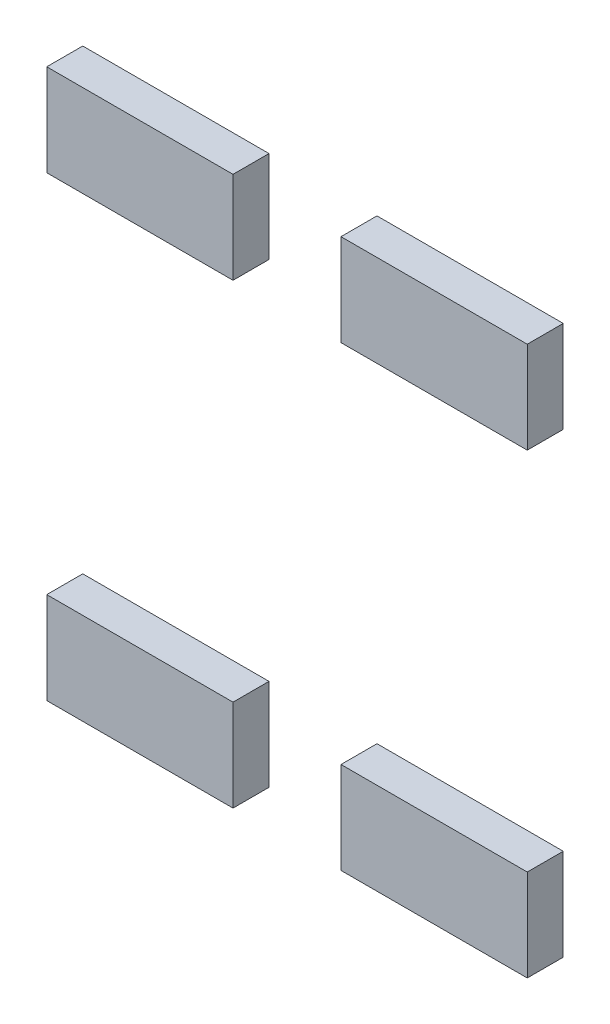
ISO-10303-21;
HEADER;
FILE_DESCRIPTION(('STEP AP214'),'2;1');
FILE_NAME('part.step','',(''),(''),'','','');
FILE_SCHEMA(('AUTOMOTIVE_DESIGN { 1 0 10303 214 1 1 1 1 }'));
ENDSEC;
DATA;
#1=APPLICATION_CONTEXT('core data for automotive mechanical design processes');
#2=APPLICATION_PROTOCOL_DEFINITION('international standard','automotive_design',2000,#1);
#3=PRODUCT_CONTEXT('',#1,'mechanical');
#4=PRODUCT('Part','Part','',(#3));
#5=PRODUCT_RELATED_PRODUCT_CATEGORY('part','',(#4));
#6=PRODUCT_DEFINITION_FORMATION('','',#4);
#7=PRODUCT_DEFINITION_CONTEXT('part definition',#1,'design');
#8=PRODUCT_DEFINITION('design','',#6,#7);
#9=PRODUCT_DEFINITION_SHAPE('','',#8);
#10=(LENGTH_UNIT() NAMED_UNIT(*) SI_UNIT(.MILLI.,.METRE.));
#11=(NAMED_UNIT(*) PLANE_ANGLE_UNIT() SI_UNIT($,.RADIAN.));
#12=(NAMED_UNIT(*) SI_UNIT($,.STERADIAN.) SOLID_ANGLE_UNIT());
#13=UNCERTAINTY_MEASURE_WITH_UNIT(LENGTH_MEASURE(1.E-05),#10,'distance_accuracy_value','');
#14=(GEOMETRIC_REPRESENTATION_CONTEXT(3) GLOBAL_UNCERTAINTY_ASSIGNED_CONTEXT((#13)) GLOBAL_UNIT_ASSIGNED_CONTEXT((#10,
#11,#12)) REPRESENTATION_CONTEXT('',''));
#15=CARTESIAN_POINT('',(0.,0.,0.));
#16=DIRECTION('',(0.,0.,1.));
#17=DIRECTION('',(1.,0.,0.));
#18=AXIS2_PLACEMENT_3D('',#15,#16,#17);
#19=CARTESIAN_POINT('',(55.000001221491,70.3750006,0.));
#20=DIRECTION('',(0.,0.,-1.));
#21=DIRECTION('',(-1.,0.,0.));
#22=AXIS2_PLACEMENT_3D('',#19,#20,#21);
#23=PLANE('',#22);
#24=DIRECTION('',(1.19248806385E-08,-1.,0.));
#25=VECTOR('',#24,1.);
#26=CARTESIAN_POINT('',(54.700001193985,72.681561596423,0.));
#27=LINE('',#26,#25);
#28=CARTESIAN_POINT('',(54.7000012018149,72.0250005902513,0.));
#29=VERTEX_POINT('',#28);
#30=CARTESIAN_POINT('',(54.7000012063758,71.515000596423,0.));
#31=VERTEX_POINT('',#30);
#32=EDGE_CURVE('P0_E20',#29,#31,#27,.T.);
#33=ORIENTED_EDGE('',*,*,#32,.T.);
#34=DIRECTION('',(1.,1.19248806385E-08,0.));
#35=VECTOR('',#34,1.);
#36=CARTESIAN_POINT('',(58.665001207896,71.515000643705,0.));
#37=LINE('',#36,#35);
#38=CARTESIAN_POINT('',(53.6650012078963,71.5150005871659,0.));
#39=VERTEX_POINT('',#38);
#40=EDGE_CURVE('P0_E81',#39,#31,#37,.T.);
#41=ORIENTED_EDGE('',*,*,#40,.F.);
#42=DIRECTION('',(1.19248806385E-08,-1.,0.));
#43=VECTOR('',#42,1.);
#44=CARTESIAN_POINT('',(53.665001241167,68.72500058408,0.));
#45=LINE('',#44,#43);
#46=CARTESIAN_POINT('',(53.6650012048555,72.02500058408,0.));
#47=VERTEX_POINT('',#46);
#48=EDGE_CURVE('P0_E55',#47,#39,#45,.T.);
#49=ORIENTED_EDGE('',*,*,#48,.F.);
#50=DIRECTION('',(-1.,-1.19248806385E-08,0.));
#51=VECTOR('',#50,1.);
#52=CARTESIAN_POINT('',(53.665001201815,72.02500058408,0.));
#53=LINE('',#52,#51);
#54=EDGE_CURVE('P0_E57',#29,#47,#53,.T.);
#55=ORIENTED_EDGE('',*,*,#54,.F.);
#56=EDGE_LOOP('',(#33,#41,#49,#55));
#57=FACE_BOUND('',#56,.T.);
#58=ADVANCED_FACE('P0_F17',(#57),#23,.T.);
#59=CARTESIAN_POINT('',(54.700001193985,72.681561596423,5.));
#60=DIRECTION('',(-1.,-1.19248806385E-08,0.));
#61=DIRECTION('',(1.19248806385E-08,-1.,0.));
#62=AXIS2_PLACEMENT_3D('',#59,#60,#61);
#63=PLANE('',#62);
#64=DIRECTION('',(0.,1.,0.));
#65=VECTOR('',#64,1.);
#66=CARTESIAN_POINT('',(54.700001207896,68.468354556295,0.199999999999999));
#67=LINE('',#66,#65);
#68=CARTESIAN_POINT('',(54.7000012078961,71.5150005933372,0.199999999999999));
#69=VERTEX_POINT('',#68);
#70=CARTESIAN_POINT('',(54.700001203335,72.0250005964228,0.199999999999998));
#71=VERTEX_POINT('',#70);
#72=EDGE_CURVE('P0_E83',#69,#71,#67,.T.);
#73=ORIENTED_EDGE('',*,*,#72,.F.);
#74=DIRECTION('',(0.,0.,1.));
#75=VECTOR('',#74,1.);
#76=CARTESIAN_POINT('',(54.700001207896,71.5150005964229,2.57));
#77=LINE('',#76,#75);
#78=EDGE_CURVE('P0_E68',#31,#69,#77,.T.);
#79=ORIENTED_EDGE('',*,*,#78,.F.);
#80=ORIENTED_EDGE('',*,*,#32,.F.);
#81=DIRECTION('',(0.,0.,1.));
#82=VECTOR('',#81,1.);
#83=CARTESIAN_POINT('',(54.700001201815,72.0250005964223,0.));
#84=LINE('',#83,#82);
#85=EDGE_CURVE('P0_E63',#71,#29,#84,.F.);
#86=ORIENTED_EDGE('',*,*,#85,.F.);
#87=EDGE_LOOP('',(#73,#79,#80,#86));
#88=FACE_BOUND('',#87,.T.);
#89=ADVANCED_FACE('P0_F65',(#88),#63,.F.);
#90=CARTESIAN_POINT('',(53.665001201815,72.02500058408,0.));
#91=DIRECTION('',(-1.19248806385E-08,1.,0.));
#92=DIRECTION('',(-1.,-1.19248806385E-08,0.));
#93=AXIS2_PLACEMENT_3D('',#90,#91,#92);
#94=PLANE('',#93);
#95=DIRECTION('',(1.,0.,0.));
#96=VECTOR('',#95,1.);
#97=CARTESIAN_POINT('',(51.335001244227,72.025000596423,0.2));
#98=LINE('',#97,#96);
#99=CARTESIAN_POINT('',(53.665001201815,72.0250005871658,0.2));
#100=VERTEX_POINT('',#99);
#101=EDGE_CURVE('P0_E72',#71,#100,#98,.F.);
#102=ORIENTED_EDGE('',*,*,#101,.F.);
#103=ORIENTED_EDGE('',*,*,#85,.T.);
#104=ORIENTED_EDGE('',*,*,#54,.T.);
#105=DIRECTION('',(0.,0.,1.));
#106=VECTOR('',#105,1.);
#107=CARTESIAN_POINT('',(53.6650012018149,72.02500058408,0.));
#108=LINE('',#107,#106);
#109=EDGE_CURVE('P0_E75',#100,#47,#108,.F.);
#110=ORIENTED_EDGE('',*,*,#109,.F.);
#111=EDGE_LOOP('',(#102,#103,#104,#110));
#112=FACE_BOUND('',#111,.T.);
#113=ADVANCED_FACE('P0_F70',(#112),#94,.T.);
#114=CARTESIAN_POINT('',(53.665001241167,68.72500058408,0.));
#115=DIRECTION('',(-1.,-1.19248806385E-08,0.));
#116=DIRECTION('',(1.19248806385E-08,-1.,0.));
#117=AXIS2_PLACEMENT_3D('',#114,#115,#116);
#118=PLANE('',#117);
#119=DIRECTION('',(0.,1.,0.));
#120=VECTOR('',#119,1.);
#121=CARTESIAN_POINT('',(53.665001201815,68.468354556295,0.199999999999999));
#122=LINE('',#121,#120);
#123=CARTESIAN_POINT('',(53.665001206376,71.5150005840802,0.2));
#124=VERTEX_POINT('',#123);
#125=EDGE_CURVE('P0_E26',#100,#124,#122,.F.);
#126=ORIENTED_EDGE('',*,*,#125,.F.);
#127=ORIENTED_EDGE('',*,*,#109,.T.);
#128=ORIENTED_EDGE('',*,*,#48,.T.);
#129=DIRECTION('',(0.,0.,1.));
#130=VECTOR('',#129,1.);
#131=CARTESIAN_POINT('',(53.665001207896,71.5150005840806,2.57));
#132=LINE('',#131,#130);
#133=EDGE_CURVE('P0_E35',#124,#39,#132,.F.);
#134=ORIENTED_EDGE('',*,*,#133,.F.);
#135=EDGE_LOOP('',(#126,#127,#128,#134));
#136=FACE_BOUND('',#135,.T.);
#137=ADVANCED_FACE('P0_F89',(#136),#118,.T.);
#138=CARTESIAN_POINT('',(58.665001207896,71.515000643705,2.57));
#139=DIRECTION('',(1.19248806385E-08,-1.,0.));
#140=DIRECTION('',(1.,1.19248806385E-08,0.));
#141=AXIS2_PLACEMENT_3D('',#138,#139,#140);
#142=PLANE('',#141);
#143=ORIENTED_EDGE('',*,*,#133,.T.);
#144=ORIENTED_EDGE('',*,*,#40,.T.);
#145=ORIENTED_EDGE('',*,*,#78,.T.);
#146=DIRECTION('',(1.,0.,0.));
#147=VECTOR('',#146,1.);
#148=CARTESIAN_POINT('',(51.335001244227,71.51500058408,0.2));
#149=LINE('',#148,#147);
#150=EDGE_CURVE('P0_E11',#124,#69,#149,.T.);
#151=ORIENTED_EDGE('',*,*,#150,.F.);
#152=EDGE_LOOP('',(#143,#144,#145,#151));
#153=FACE_BOUND('',#152,.T.);
#154=ADVANCED_FACE('P0_F91',(#153),#142,.T.);
#155=CARTESIAN_POINT('',(51.335001244227,68.468354556295,0.2));
#156=DIRECTION('',(0.,0.,1.));
#157=DIRECTION('',(1.,0.,0.));
#158=AXIS2_PLACEMENT_3D('',#155,#156,#157);
#159=PLANE('',#158);
#160=ORIENTED_EDGE('',*,*,#125,.T.);
#161=ORIENTED_EDGE('',*,*,#150,.T.);
#162=ORIENTED_EDGE('',*,*,#72,.T.);
#163=ORIENTED_EDGE('',*,*,#101,.T.);
#164=EDGE_LOOP('',(#160,#161,#162,#163));
#165=FACE_BOUND('',#164,.T.);
#166=ADVANCED_FACE('P0_F88',(#165),#159,.T.);
#167=CLOSED_SHELL('',(#58,#89,#113,#137,#154,#166));
#168=MANIFOLD_SOLID_BREP('P0_B1',#167);
#169=CARTESIAN_POINT('',(55.000001218509,70.6250006,0.));
#170=DIRECTION('',(0.,0.,-1.));
#171=DIRECTION('',(-1.,0.,0.));
#172=AXIS2_PLACEMENT_3D('',#169,#170,#171);
#173=PLANE('',#172);
#174=DIRECTION('',(1.,1.19248806385E-08,0.));
#175=VECTOR('',#174,1.);
#176=CARTESIAN_POINT('',(56.335001238185,68.97500061592,0.));
#177=LINE('',#176,#175);
#178=CARTESIAN_POINT('',(55.300001238185,68.9750006097487,0.));
#179=VERTEX_POINT('',#178);
#180=CARTESIAN_POINT('',(56.3350012351445,68.97500061592,0.));
#181=VERTEX_POINT('',#180);
#182=EDGE_CURVE('P1_E79',#179,#181,#177,.T.);
#183=ORIENTED_EDGE('',*,*,#182,.F.);
#184=DIRECTION('',(-1.19248806385E-08,1.,0.));
#185=VECTOR('',#184,1.);
#186=CARTESIAN_POINT('',(55.300001245817,68.335000603577,0.));
#187=LINE('',#186,#185);
#188=CARTESIAN_POINT('',(55.3000012351444,69.4850006035772,0.));
#189=VERTEX_POINT('',#188);
#190=EDGE_CURVE('P1_E55',#179,#189,#187,.T.);
#191=ORIENTED_EDGE('',*,*,#190,.T.);
#192=DIRECTION('',(1.,1.19248806385E-08,0.));
#193=VECTOR('',#192,1.);
#194=CARTESIAN_POINT('',(58.665001232104,69.485000643705,0.));
#195=LINE('',#194,#193);
#196=CARTESIAN_POINT('',(56.3350012321037,69.4850006128343,0.));
#197=VERTEX_POINT('',#196);
#198=EDGE_CURVE('P1_E67',#189,#197,#195,.T.);
#199=ORIENTED_EDGE('',*,*,#198,.T.);
#200=DIRECTION('',(-1.19248806385E-08,1.,0.));
#201=VECTOR('',#200,1.);
#202=CARTESIAN_POINT('',(56.335001198833,72.27500061592,0.));
#203=LINE('',#202,#201);
#204=EDGE_CURVE('P1_E20',#181,#197,#203,.T.);
#205=ORIENTED_EDGE('',*,*,#204,.F.);
#206=EDGE_LOOP('',(#183,#191,#199,#205));
#207=FACE_BOUND('',#206,.T.);
#208=ADVANCED_FACE('P1_F17',(#207),#173,.T.);
#209=CARTESIAN_POINT('',(56.335001198833,72.27500061592,0.));
#210=DIRECTION('',(1.,1.19248806385E-08,0.));
#211=DIRECTION('',(-1.19248806385E-08,1.,0.));
#212=AXIS2_PLACEMENT_3D('',#209,#210,#211);
#213=PLANE('',#212);
#214=DIRECTION('',(0.,1.,0.));
#215=VECTOR('',#214,1.);
#216=CARTESIAN_POINT('',(56.335001238185,68.718354556295,0.199999999999999));
#217=LINE('',#216,#215);
#218=CARTESIAN_POINT('',(56.3350012381851,68.9750006128342,0.2));
#219=VERTEX_POINT('',#218);
#220=CARTESIAN_POINT('',(56.335001233624,69.48500061592,0.2));
#221=VERTEX_POINT('',#220);
#222=EDGE_CURVE('P1_E83',#219,#221,#217,.T.);
#223=ORIENTED_EDGE('',*,*,#222,.F.);
#224=DIRECTION('',(0.,0.,1.));
#225=VECTOR('',#224,1.);
#226=CARTESIAN_POINT('',(56.335001238185,68.97500061592,0.));
#227=LINE('',#226,#225);
#228=EDGE_CURVE('P1_E65',#181,#219,#227,.T.);
#229=ORIENTED_EDGE('',*,*,#228,.F.);
#230=ORIENTED_EDGE('',*,*,#204,.T.);
#231=DIRECTION('',(0.,0.,1.));
#232=VECTOR('',#231,1.);
#233=CARTESIAN_POINT('',(56.335001232104,69.48500061592,2.57));
#234=LINE('',#233,#232);
#235=EDGE_CURVE('P1_E62',#197,#221,#234,.T.);
#236=ORIENTED_EDGE('',*,*,#235,.T.);
#237=EDGE_LOOP('',(#223,#229,#230,#236));
#238=FACE_BOUND('',#237,.T.);
#239=ADVANCED_FACE('P1_F60',(#238),#213,.T.);
#240=CARTESIAN_POINT('',(58.665001232104,69.485000643705,2.57));
#241=DIRECTION('',(1.19248806385E-08,-1.,0.));
#242=DIRECTION('',(1.,1.19248806385E-08,0.));
#243=AXIS2_PLACEMENT_3D('',#240,#241,#242);
#244=PLANE('',#243);
#245=DIRECTION('',(0.,0.,1.));
#246=VECTOR('',#245,1.);
#247=CARTESIAN_POINT('',(55.3000012321034,69.485000603577,5.));
#248=LINE('',#247,#246);
#249=CARTESIAN_POINT('',(55.3000012321039,69.4850006066631,0.199999999999999));
#250=VERTEX_POINT('',#249);
#251=EDGE_CURVE('P1_E77',#189,#250,#248,.T.);
#252=ORIENTED_EDGE('',*,*,#251,.T.);
#253=DIRECTION('',(1.,0.,0.));
#254=VECTOR('',#253,1.);
#255=CARTESIAN_POINT('',(51.335001241246,69.48500061592,0.2));
#256=LINE('',#255,#254);
#257=EDGE_CURVE('P1_E73',#221,#250,#256,.F.);
#258=ORIENTED_EDGE('',*,*,#257,.F.);
#259=ORIENTED_EDGE('',*,*,#235,.F.);
#260=ORIENTED_EDGE('',*,*,#198,.F.);
#261=EDGE_LOOP('',(#252,#258,#259,#260));
#262=FACE_BOUND('',#261,.T.);
#263=ADVANCED_FACE('P1_F71',(#262),#244,.F.);
#264=CARTESIAN_POINT('',(55.300001245817,68.335000603577,5.));
#265=DIRECTION('',(1.,1.19248806385E-08,0.));
#266=DIRECTION('',(-1.19248806385E-08,1.,0.));
#267=AXIS2_PLACEMENT_3D('',#264,#265,#266);
#268=PLANE('',#267);
#269=DIRECTION('',(0.,1.,0.));
#270=VECTOR('',#269,1.);
#271=CARTESIAN_POINT('',(55.300001232104,68.718354556295,0.199999999999999));
#272=LINE('',#271,#270);
#273=CARTESIAN_POINT('',(55.3000012366648,68.9750006035772,0.199999999999998));
#274=VERTEX_POINT('',#273);
#275=EDGE_CURVE('P1_E26',#250,#274,#272,.F.);
#276=ORIENTED_EDGE('',*,*,#275,.F.);
#277=ORIENTED_EDGE('',*,*,#251,.F.);
#278=ORIENTED_EDGE('',*,*,#190,.F.);
#279=DIRECTION('',(0.,0.,1.));
#280=VECTOR('',#279,1.);
#281=CARTESIAN_POINT('',(55.300001238185,68.9750006035777,0.));
#282=LINE('',#281,#280);
#283=EDGE_CURVE('P1_E35',#274,#179,#282,.F.);
#284=ORIENTED_EDGE('',*,*,#283,.F.);
#285=EDGE_LOOP('',(#276,#277,#278,#284));
#286=FACE_BOUND('',#285,.T.);
#287=ADVANCED_FACE('P1_F89',(#286),#268,.F.);
#288=CARTESIAN_POINT('',(56.335001238185,68.97500061592,0.));
#289=DIRECTION('',(1.19248806385E-08,-1.,0.));
#290=DIRECTION('',(1.,1.19248806385E-08,0.));
#291=AXIS2_PLACEMENT_3D('',#288,#289,#290);
#292=PLANE('',#291);
#293=DIRECTION('',(1.,0.,0.));
#294=VECTOR('',#293,1.);
#295=CARTESIAN_POINT('',(51.335001241246,68.975000603577,0.2));
#296=LINE('',#295,#294);
#297=EDGE_CURVE('P1_E11',#274,#219,#296,.T.);
#298=ORIENTED_EDGE('',*,*,#297,.F.);
#299=ORIENTED_EDGE('',*,*,#283,.T.);
#300=ORIENTED_EDGE('',*,*,#182,.T.);
#301=ORIENTED_EDGE('',*,*,#228,.T.);
#302=EDGE_LOOP('',(#298,#299,#300,#301));
#303=FACE_BOUND('',#302,.T.);
#304=ADVANCED_FACE('P1_F91',(#303),#292,.T.);
#305=CARTESIAN_POINT('',(51.335001241246,68.718354556295,0.2));
#306=DIRECTION('',(0.,0.,1.));
#307=DIRECTION('',(1.,0.,0.));
#308=AXIS2_PLACEMENT_3D('',#305,#306,#307);
#309=PLANE('',#308);
#310=ORIENTED_EDGE('',*,*,#275,.T.);
#311=ORIENTED_EDGE('',*,*,#297,.T.);
#312=ORIENTED_EDGE('',*,*,#222,.T.);
#313=ORIENTED_EDGE('',*,*,#257,.T.);
#314=EDGE_LOOP('',(#310,#311,#312,#313));
#315=FACE_BOUND('',#314,.T.);
#316=ADVANCED_FACE('P1_F88',(#315),#309,.T.);
#317=CLOSED_SHELL('',(#208,#239,#263,#287,#304,#316));
#318=MANIFOLD_SOLID_BREP('P1_B1',#317);
#319=CARTESIAN_POINT('',(55.000001221491,70.3750006,0.));
#320=DIRECTION('',(0.,0.,-1.));
#321=DIRECTION('',(-1.,0.,0.));
#322=AXIS2_PLACEMENT_3D('',#319,#320,#321);
#323=PLANE('',#322);
#324=DIRECTION('',(-1.19248806385E-08,1.,0.));
#325=VECTOR('',#324,1.);
#326=CARTESIAN_POINT('',(56.335001201815,72.02500061592,0.));
#327=LINE('',#326,#325);
#328=CARTESIAN_POINT('',(56.3350012063761,71.51500061592,0.));
#329=VERTEX_POINT('',#328);
#330=CARTESIAN_POINT('',(56.335001201815,72.0250006097484,0.));
#331=VERTEX_POINT('',#330);
#332=EDGE_CURVE('P2_E20',#329,#331,#327,.T.);
#333=ORIENTED_EDGE('',*,*,#332,.F.);
#334=DIRECTION('',(1.,1.19248806385E-08,0.));
#335=VECTOR('',#334,1.);
#336=CARTESIAN_POINT('',(58.665001207896,71.515000643705,0.));
#337=LINE('',#336,#335);
#338=CARTESIAN_POINT('',(55.3000012078963,71.5150006066629,0.));
#339=VERTEX_POINT('',#338);
#340=EDGE_CURVE('P2_E81',#339,#329,#337,.T.);
#341=ORIENTED_EDGE('',*,*,#340,.F.);
#342=DIRECTION('',(-1.19248806385E-08,1.,0.));
#343=VECTOR('',#342,1.);
#344=CARTESIAN_POINT('',(55.300001248799,68.085000603577,0.));
#345=LINE('',#344,#343);
#346=CARTESIAN_POINT('',(55.3000012048555,72.0250006035771,0.));
#347=VERTEX_POINT('',#346);
#348=EDGE_CURVE('P2_E55',#339,#347,#345,.T.);
#349=ORIENTED_EDGE('',*,*,#348,.T.);
#350=DIRECTION('',(-1.,-1.19248806385E-08,0.));
#351=VECTOR('',#350,1.);
#352=CARTESIAN_POINT('',(53.665001201815,72.02500058408,0.));
#353=LINE('',#352,#351);
#354=EDGE_CURVE('P2_E57',#331,#347,#353,.T.);
#355=ORIENTED_EDGE('',*,*,#354,.F.);
#356=EDGE_LOOP('',(#333,#341,#349,#355));
#357=FACE_BOUND('',#356,.T.);
#358=ADVANCED_FACE('P2_F17',(#357),#323,.T.);
#359=CARTESIAN_POINT('',(56.335001201815,72.02500061592,0.));
#360=DIRECTION('',(1.,1.19248806385E-08,0.));
#361=DIRECTION('',(-1.19248806385E-08,1.,0.));
#362=AXIS2_PLACEMENT_3D('',#359,#360,#361);
#363=PLANE('',#362);
#364=DIRECTION('',(0.,1.,0.));
#365=VECTOR('',#364,1.);
#366=CARTESIAN_POINT('',(56.335001207896,68.468354556295,0.199999999999999));
#367=LINE('',#366,#365);
#368=CARTESIAN_POINT('',(56.3350012078963,71.5150006128343,0.2));
#369=VERTEX_POINT('',#368);
#370=CARTESIAN_POINT('',(56.3350012033352,72.0250006159199,0.2));
#371=VERTEX_POINT('',#370);
#372=EDGE_CURVE('P2_E83',#369,#371,#367,.T.);
#373=ORIENTED_EDGE('',*,*,#372,.F.);
#374=DIRECTION('',(0.,0.,1.));
#375=VECTOR('',#374,1.);
#376=CARTESIAN_POINT('',(56.335001207896,71.51500061592,2.57));
#377=LINE('',#376,#375);
#378=EDGE_CURVE('P2_E68',#329,#369,#377,.T.);
#379=ORIENTED_EDGE('',*,*,#378,.F.);
#380=ORIENTED_EDGE('',*,*,#332,.T.);
#381=DIRECTION('',(0.,0.,1.));
#382=VECTOR('',#381,1.);
#383=CARTESIAN_POINT('',(56.335001201815,72.0250006159195,0.));
#384=LINE('',#383,#382);
#385=EDGE_CURVE('P2_E63',#371,#331,#384,.F.);
#386=ORIENTED_EDGE('',*,*,#385,.F.);
#387=EDGE_LOOP('',(#373,#379,#380,#386));
#388=FACE_BOUND('',#387,.T.);
#389=ADVANCED_FACE('P2_F65',(#388),#363,.T.);
#390=CARTESIAN_POINT('',(53.665001201815,72.02500058408,0.));
#391=DIRECTION('',(-1.19248806385E-08,1.,0.));
#392=DIRECTION('',(-1.,-1.19248806385E-08,0.));
#393=AXIS2_PLACEMENT_3D('',#390,#391,#392);
#394=PLANE('',#393);
#395=DIRECTION('',(1.,0.,0.));
#396=VECTOR('',#395,1.);
#397=CARTESIAN_POINT('',(51.335001244227,72.02500061592,0.2));
#398=LINE('',#397,#396);
#399=CARTESIAN_POINT('',(55.300001201815,72.0250006066629,0.2));
#400=VERTEX_POINT('',#399);
#401=EDGE_CURVE('P2_E72',#371,#400,#398,.F.);
#402=ORIENTED_EDGE('',*,*,#401,.F.);
#403=ORIENTED_EDGE('',*,*,#385,.T.);
#404=ORIENTED_EDGE('',*,*,#354,.T.);
#405=DIRECTION('',(0.,0.,1.));
#406=VECTOR('',#405,1.);
#407=CARTESIAN_POINT('',(55.300001201815,72.025000603577,5.));
#408=LINE('',#407,#406);
#409=EDGE_CURVE('P2_E75',#347,#400,#408,.T.);
#410=ORIENTED_EDGE('',*,*,#409,.T.);
#411=EDGE_LOOP('',(#402,#403,#404,#410));
#412=FACE_BOUND('',#411,.T.);
#413=ADVANCED_FACE('P2_F70',(#412),#394,.T.);
#414=CARTESIAN_POINT('',(55.300001248799,68.085000603577,5.));
#415=DIRECTION('',(1.,1.19248806385E-08,0.));
#416=DIRECTION('',(-1.19248806385E-08,1.,0.));
#417=AXIS2_PLACEMENT_3D('',#414,#415,#416);
#418=PLANE('',#417);
#419=DIRECTION('',(0.,1.,0.));
#420=VECTOR('',#419,1.);
#421=CARTESIAN_POINT('',(55.300001201815,68.468354556295,0.199999999999999));
#422=LINE('',#421,#420);
#423=CARTESIAN_POINT('',(55.3000012063761,71.5150006035772,0.199999999999998));
#424=VERTEX_POINT('',#423);
#425=EDGE_CURVE('P2_E26',#400,#424,#422,.F.);
#426=ORIENTED_EDGE('',*,*,#425,.F.);
#427=ORIENTED_EDGE('',*,*,#409,.F.);
#428=ORIENTED_EDGE('',*,*,#348,.F.);
#429=DIRECTION('',(0.,0.,1.));
#430=VECTOR('',#429,1.);
#431=CARTESIAN_POINT('',(55.300001207896,71.5150006035778,2.57));
#432=LINE('',#431,#430);
#433=EDGE_CURVE('P2_E35',#424,#339,#432,.F.);
#434=ORIENTED_EDGE('',*,*,#433,.F.);
#435=EDGE_LOOP('',(#426,#427,#428,#434));
#436=FACE_BOUND('',#435,.T.);
#437=ADVANCED_FACE('P2_F89',(#436),#418,.F.);
#438=CARTESIAN_POINT('',(58.665001207896,71.515000643705,2.57));
#439=DIRECTION('',(1.19248806385E-08,-1.,0.));
#440=DIRECTION('',(1.,1.19248806385E-08,0.));
#441=AXIS2_PLACEMENT_3D('',#438,#439,#440);
#442=PLANE('',#441);
#443=ORIENTED_EDGE('',*,*,#433,.T.);
#444=ORIENTED_EDGE('',*,*,#340,.T.);
#445=ORIENTED_EDGE('',*,*,#378,.T.);
#446=DIRECTION('',(1.,0.,0.));
#447=VECTOR('',#446,1.);
#448=CARTESIAN_POINT('',(51.335001244227,71.515000603577,0.2));
#449=LINE('',#448,#447);
#450=EDGE_CURVE('P2_E11',#424,#369,#449,.T.);
#451=ORIENTED_EDGE('',*,*,#450,.F.);
#452=EDGE_LOOP('',(#443,#444,#445,#451));
#453=FACE_BOUND('',#452,.T.);
#454=ADVANCED_FACE('P2_F91',(#453),#442,.T.);
#455=CARTESIAN_POINT('',(51.335001244227,68.468354556295,0.2));
#456=DIRECTION('',(0.,0.,1.));
#457=DIRECTION('',(1.,0.,0.));
#458=AXIS2_PLACEMENT_3D('',#455,#456,#457);
#459=PLANE('',#458);
#460=ORIENTED_EDGE('',*,*,#425,.T.);
#461=ORIENTED_EDGE('',*,*,#450,.T.);
#462=ORIENTED_EDGE('',*,*,#372,.T.);
#463=ORIENTED_EDGE('',*,*,#401,.T.);
#464=EDGE_LOOP('',(#460,#461,#462,#463));
#465=FACE_BOUND('',#464,.T.);
#466=ADVANCED_FACE('P2_F88',(#465),#459,.T.);
#467=CLOSED_SHELL('',(#358,#389,#413,#437,#454,#466));
#468=MANIFOLD_SOLID_BREP('P2_B1',#467);
#469=CARTESIAN_POINT('',(55.000001218509,70.6250006,0.));
#470=DIRECTION('',(0.,0.,-1.));
#471=DIRECTION('',(-1.,0.,0.));
#472=AXIS2_PLACEMENT_3D('',#469,#470,#471);
#473=PLANE('',#472);
#474=DIRECTION('',(1.,1.19248806385E-08,0.));
#475=VECTOR('',#474,1.);
#476=CARTESIAN_POINT('',(56.335001238185,68.97500061592,0.));
#477=LINE('',#476,#475);
#478=CARTESIAN_POINT('',(53.665001238185,68.9750005902516,0.));
#479=VERTEX_POINT('',#478);
#480=CARTESIAN_POINT('',(54.7000012351446,68.9750005964229,0.));
#481=VERTEX_POINT('',#480);
#482=EDGE_CURVE('P3_E79',#479,#481,#477,.T.);
#483=ORIENTED_EDGE('',*,*,#482,.F.);
#484=DIRECTION('',(1.19248806385E-08,-1.,0.));
#485=VECTOR('',#484,1.);
#486=CARTESIAN_POINT('',(53.665001238185,68.97500058408,0.));
#487=LINE('',#486,#485);
#488=CARTESIAN_POINT('',(53.6650012351443,69.4850005840802,0.));
#489=VERTEX_POINT('',#488);
#490=EDGE_CURVE('P3_E55',#489,#479,#487,.T.);
#491=ORIENTED_EDGE('',*,*,#490,.F.);
#492=DIRECTION('',(1.,1.19248806385E-08,0.));
#493=VECTOR('',#492,1.);
#494=CARTESIAN_POINT('',(58.665001232104,69.485000643705,0.));
#495=LINE('',#494,#493);
#496=CARTESIAN_POINT('',(54.7000012321039,69.4850005933372,0.));
#497=VERTEX_POINT('',#496);
#498=EDGE_CURVE('P3_E67',#489,#497,#495,.T.);
#499=ORIENTED_EDGE('',*,*,#498,.T.);
#500=DIRECTION('',(1.19248806385E-08,-1.,0.));
#501=VECTOR('',#500,1.);
#502=CARTESIAN_POINT('',(54.700001191004,72.931561596423,0.));
#503=LINE('',#502,#501);
#504=EDGE_CURVE('P3_E20',#497,#481,#503,.T.);
#505=ORIENTED_EDGE('',*,*,#504,.T.);
#506=EDGE_LOOP('',(#483,#491,#499,#505));
#507=FACE_BOUND('',#506,.T.);
#508=ADVANCED_FACE('P3_F17',(#507),#473,.T.);
#509=CARTESIAN_POINT('',(54.700001191004,72.931561596423,5.));
#510=DIRECTION('',(-1.,-1.19248806385E-08,0.));
#511=DIRECTION('',(1.19248806385E-08,-1.,0.));
#512=AXIS2_PLACEMENT_3D('',#509,#510,#511);
#513=PLANE('',#512);
#514=DIRECTION('',(0.,1.,0.));
#515=VECTOR('',#514,1.);
#516=CARTESIAN_POINT('',(54.700001238185,68.718354556295,0.199999999999999));
#517=LINE('',#516,#515);
#518=CARTESIAN_POINT('',(54.7000012381853,68.9750005933372,0.199999999999999));
#519=VERTEX_POINT('',#518);
#520=CARTESIAN_POINT('',(54.7000012336242,69.485000596423,0.199999999999998));
#521=VERTEX_POINT('',#520);
#522=EDGE_CURVE('P3_E83',#519,#521,#517,.T.);
#523=ORIENTED_EDGE('',*,*,#522,.F.);
#524=DIRECTION('',(0.,0.,1.));
#525=VECTOR('',#524,1.);
#526=CARTESIAN_POINT('',(54.700001238185,68.9750005964228,0.));
#527=LINE('',#526,#525);
#528=EDGE_CURVE('P3_E65',#481,#519,#527,.T.);
#529=ORIENTED_EDGE('',*,*,#528,.F.);
#530=ORIENTED_EDGE('',*,*,#504,.F.);
#531=DIRECTION('',(0.,0.,1.));
#532=VECTOR('',#531,1.);
#533=CARTESIAN_POINT('',(54.700001232104,69.4850005964229,2.57));
#534=LINE('',#533,#532);
#535=EDGE_CURVE('P3_E62',#497,#521,#534,.T.);
#536=ORIENTED_EDGE('',*,*,#535,.T.);
#537=EDGE_LOOP('',(#523,#529,#530,#536));
#538=FACE_BOUND('',#537,.T.);
#539=ADVANCED_FACE('P3_F60',(#538),#513,.F.);
#540=CARTESIAN_POINT('',(58.665001232104,69.485000643705,2.57));
#541=DIRECTION('',(1.19248806385E-08,-1.,0.));
#542=DIRECTION('',(1.,1.19248806385E-08,0.));
#543=AXIS2_PLACEMENT_3D('',#540,#541,#542);
#544=PLANE('',#543);
#545=DIRECTION('',(0.,0.,1.));
#546=VECTOR('',#545,1.);
#547=CARTESIAN_POINT('',(53.6650012321033,69.48500058408,0.));
#548=LINE('',#547,#546);
#549=CARTESIAN_POINT('',(53.6650012321038,69.4850005871661,0.199999999999999));
#550=VERTEX_POINT('',#549);
#551=EDGE_CURVE('P3_E77',#550,#489,#548,.F.);
#552=ORIENTED_EDGE('',*,*,#551,.F.);
#553=DIRECTION('',(1.,0.,0.));
#554=VECTOR('',#553,1.);
#555=CARTESIAN_POINT('',(51.335001241246,69.485000596423,0.2));
#556=LINE('',#555,#554);
#557=EDGE_CURVE('P3_E73',#521,#550,#556,.F.);
#558=ORIENTED_EDGE('',*,*,#557,.F.);
#559=ORIENTED_EDGE('',*,*,#535,.F.);
#560=ORIENTED_EDGE('',*,*,#498,.F.);
#561=EDGE_LOOP('',(#552,#558,#559,#560));
#562=FACE_BOUND('',#561,.T.);
#563=ADVANCED_FACE('P3_F71',(#562),#544,.F.);
#564=CARTESIAN_POINT('',(53.665001238185,68.97500058408,0.));
#565=DIRECTION('',(-1.,-1.19248806385E-08,0.));
#566=DIRECTION('',(1.19248806385E-08,-1.,0.));
#567=AXIS2_PLACEMENT_3D('',#564,#565,#566);
#568=PLANE('',#567);
#569=DIRECTION('',(0.,1.,0.));
#570=VECTOR('',#569,1.);
#571=CARTESIAN_POINT('',(53.665001232104,68.718354556295,0.199999999999999));
#572=LINE('',#571,#570);
#573=CARTESIAN_POINT('',(53.6650012366648,68.9750005840801,0.2));
#574=VERTEX_POINT('',#573);
#575=EDGE_CURVE('P3_E26',#550,#574,#572,.F.);
#576=ORIENTED_EDGE('',*,*,#575,.F.);
#577=ORIENTED_EDGE('',*,*,#551,.T.);
#578=ORIENTED_EDGE('',*,*,#490,.T.);
#579=DIRECTION('',(0.,0.,1.));
#580=VECTOR('',#579,1.);
#581=CARTESIAN_POINT('',(53.665001238185,68.9750005840806,0.));
#582=LINE('',#581,#580);
#583=EDGE_CURVE('P3_E35',#574,#479,#582,.F.);
#584=ORIENTED_EDGE('',*,*,#583,.F.);
#585=EDGE_LOOP('',(#576,#577,#578,#584));
#586=FACE_BOUND('',#585,.T.);
#587=ADVANCED_FACE('P3_F89',(#586),#568,.T.);
#588=CARTESIAN_POINT('',(56.335001238185,68.97500061592,0.));
#589=DIRECTION('',(1.19248806385E-08,-1.,0.));
#590=DIRECTION('',(1.,1.19248806385E-08,0.));
#591=AXIS2_PLACEMENT_3D('',#588,#589,#590);
#592=PLANE('',#591);
#593=DIRECTION('',(1.,0.,0.));
#594=VECTOR('',#593,1.);
#595=CARTESIAN_POINT('',(51.335001241246,68.97500058408,0.2));
#596=LINE('',#595,#594);
#597=EDGE_CURVE('P3_E11',#574,#519,#596,.T.);
#598=ORIENTED_EDGE('',*,*,#597,.F.);
#599=ORIENTED_EDGE('',*,*,#583,.T.);
#600=ORIENTED_EDGE('',*,*,#482,.T.);
#601=ORIENTED_EDGE('',*,*,#528,.T.);
#602=EDGE_LOOP('',(#598,#599,#600,#601));
#603=FACE_BOUND('',#602,.T.);
#604=ADVANCED_FACE('P3_F91',(#603),#592,.T.);
#605=CARTESIAN_POINT('',(51.335001241246,68.718354556295,0.2));
#606=DIRECTION('',(0.,0.,1.));
#607=DIRECTION('',(1.,0.,0.));
#608=AXIS2_PLACEMENT_3D('',#605,#606,#607);
#609=PLANE('',#608);
#610=ORIENTED_EDGE('',*,*,#575,.T.);
#611=ORIENTED_EDGE('',*,*,#597,.T.);
#612=ORIENTED_EDGE('',*,*,#522,.T.);
#613=ORIENTED_EDGE('',*,*,#557,.T.);
#614=EDGE_LOOP('',(#610,#611,#612,#613));
#615=FACE_BOUND('',#614,.T.);
#616=ADVANCED_FACE('P3_F88',(#615),#609,.T.);
#617=CLOSED_SHELL('',(#508,#539,#563,#587,#604,#616));
#618=MANIFOLD_SOLID_BREP('P3_B1',#617);
#619=ADVANCED_BREP_SHAPE_REPRESENTATION('',(#18,#168,#318,#468,#618),#14);
#620=SHAPE_DEFINITION_REPRESENTATION(#9,#619);
ENDSEC;
END-ISO-10303-21;
